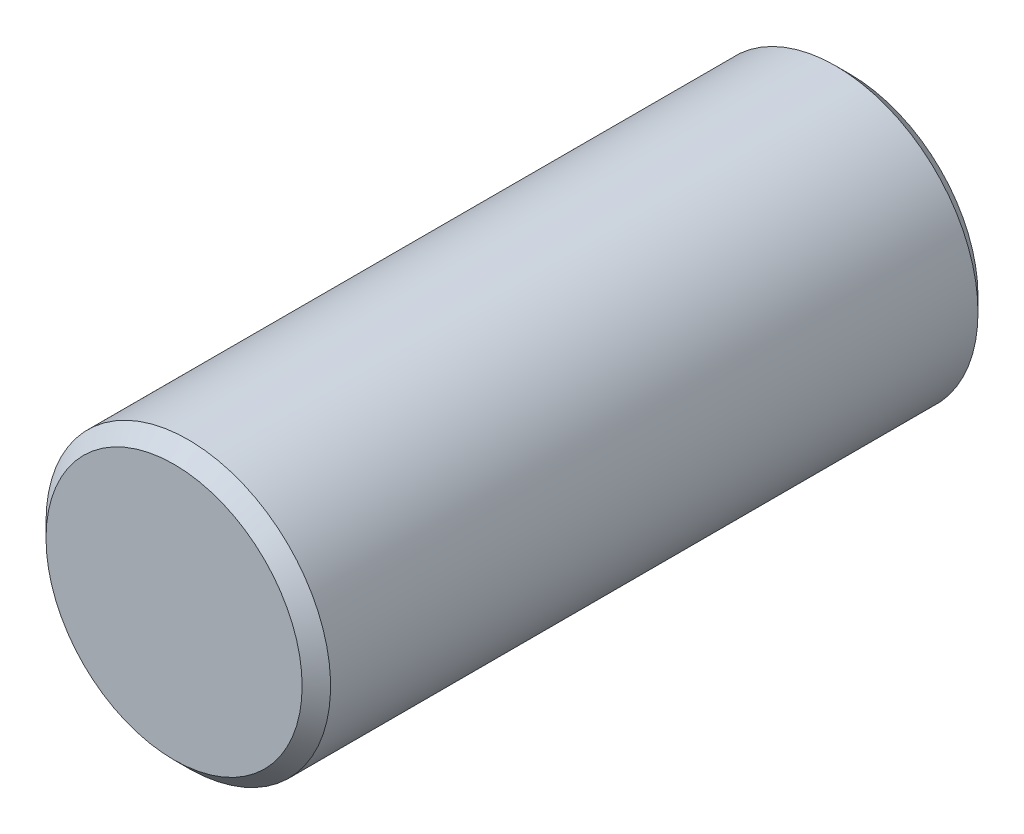
ISO-10303-21;
HEADER;
FILE_DESCRIPTION(('STEP AP214'),'2;1');
FILE_NAME('part.step','',(''),(''),'','','');
FILE_SCHEMA(('AUTOMOTIVE_DESIGN { 1 0 10303 214 1 1 1 1 }'));
ENDSEC;
DATA;
#1=APPLICATION_CONTEXT('core data for automotive mechanical design processes');
#2=APPLICATION_PROTOCOL_DEFINITION('international standard','automotive_design',2000,#1);
#3=PRODUCT_CONTEXT('',#1,'mechanical');
#4=PRODUCT('Part','Part','',(#3));
#5=PRODUCT_RELATED_PRODUCT_CATEGORY('part','',(#4));
#6=PRODUCT_DEFINITION_FORMATION('','',#4);
#7=PRODUCT_DEFINITION_CONTEXT('part definition',#1,'design');
#8=PRODUCT_DEFINITION('design','',#6,#7);
#9=PRODUCT_DEFINITION_SHAPE('','',#8);
#10=(LENGTH_UNIT() NAMED_UNIT(*) SI_UNIT(.MILLI.,.METRE.));
#11=(NAMED_UNIT(*) PLANE_ANGLE_UNIT() SI_UNIT($,.RADIAN.));
#12=(NAMED_UNIT(*) SI_UNIT($,.STERADIAN.) SOLID_ANGLE_UNIT());
#13=UNCERTAINTY_MEASURE_WITH_UNIT(LENGTH_MEASURE(1.E-05),#10,'distance_accuracy_value','');
#14=(GEOMETRIC_REPRESENTATION_CONTEXT(3) GLOBAL_UNCERTAINTY_ASSIGNED_CONTEXT((#13)) GLOBAL_UNIT_ASSIGNED_CONTEXT((#10,
#11,#12)) REPRESENTATION_CONTEXT('',''));
#15=CARTESIAN_POINT('',(0.,0.,0.));
#16=DIRECTION('',(0.,0.,1.));
#17=DIRECTION('',(1.,0.,0.));
#18=AXIS2_PLACEMENT_3D('',#15,#16,#17);
#19=CARTESIAN_POINT('',(0.,0.,60.325));
#20=DIRECTION('',(0.,0.,-1.));
#21=DIRECTION('',(-1.,0.,0.));
#22=AXIS2_PLACEMENT_3D('',#19,#20,#21);
#23=CYLINDRICAL_SURFACE('',#22,12.7);
#24=CARTESIAN_POINT('',(0.,0.,1.27000000000002));
#25=DIRECTION('',(0.,0.,1.));
#26=DIRECTION('',(1.,0.,0.));
#27=AXIS2_PLACEMENT_3D('',#24,#25,#26);
#28=CIRCLE('',#27,12.7);
#29=CARTESIAN_POINT('',(-12.7,0.,1.27000000000002));
#30=VERTEX_POINT('',#29);
#31=EDGE_CURVE('E45',#30,#30,#28,.T.);
#32=CARTESIAN_POINT('',(0.,0.,59.055));
#33=DIRECTION('',(0.,0.,1.));
#34=DIRECTION('',(1.,0.,0.));
#35=AXIS2_PLACEMENT_3D('',#32,#33,#34);
#36=CIRCLE('',#35,12.7);
#37=CARTESIAN_POINT('',(-12.7,0.,59.055));
#38=VERTEX_POINT('',#37);
#39=EDGE_CURVE('E49',#38,#38,#36,.F.);
#40=CARTESIAN_POINT('',(-12.7,0.,1.27000000000002));
#41=CARTESIAN_POINT('',(-12.7,0.,1.87192708333335));
#42=CARTESIAN_POINT('',(-12.7,0.,2.47385416666669));
#43=CARTESIAN_POINT('',(-12.7,0.,3.67770833333335));
#44=CARTESIAN_POINT('',(-12.7,0.,4.27963541666669));
#45=CARTESIAN_POINT('',(-12.7,0.,5.48348958333335));
#46=CARTESIAN_POINT('',(-12.7,0.,6.08541666666669));
#47=CARTESIAN_POINT('',(-12.7,0.,7.28927083333335));
#48=CARTESIAN_POINT('',(-12.7,0.,7.89119791666668));
#49=CARTESIAN_POINT('',(-12.7,0.,9.09505208333335));
#50=CARTESIAN_POINT('',(-12.7,0.,9.69697916666668));
#51=CARTESIAN_POINT('',(-12.7,0.,10.9008333333334));
#52=CARTESIAN_POINT('',(-12.7,0.,11.5027604166667));
#53=CARTESIAN_POINT('',(-12.7,0.,12.7066145833333));
#54=CARTESIAN_POINT('',(-12.7,0.,13.3085416666667));
#55=CARTESIAN_POINT('',(-12.7,0.,14.5123958333333));
#56=CARTESIAN_POINT('',(-12.7,0.,15.1143229166667));
#57=CARTESIAN_POINT('',(-12.7,0.,16.3181770833333));
#58=CARTESIAN_POINT('',(-12.7,0.,16.9201041666667));
#59=CARTESIAN_POINT('',(-12.7,0.,18.1239583333333));
#60=CARTESIAN_POINT('',(-12.7,0.,18.7258854166667));
#61=CARTESIAN_POINT('',(-12.7,0.,19.9297395833333));
#62=CARTESIAN_POINT('',(-12.7,0.,20.5316666666667));
#63=CARTESIAN_POINT('',(-12.7,0.,21.7355208333333));
#64=CARTESIAN_POINT('',(-12.7,0.,22.3374479166667));
#65=CARTESIAN_POINT('',(-12.7,0.,23.5413020833333));
#66=CARTESIAN_POINT('',(-12.7,0.,24.1432291666667));
#67=CARTESIAN_POINT('',(-12.7,0.,25.3470833333334));
#68=CARTESIAN_POINT('',(-12.7,0.,25.9490104166667));
#69=CARTESIAN_POINT('',(-12.7,0.,27.1528645833334));
#70=CARTESIAN_POINT('',(-12.7,0.,27.7547916666667));
#71=CARTESIAN_POINT('',(-12.7,0.,28.9586458333333));
#72=CARTESIAN_POINT('',(-12.7,0.,29.5605729166667));
#73=CARTESIAN_POINT('',(-12.7,0.,30.7644270833333));
#74=CARTESIAN_POINT('',(-12.7,0.,31.3663541666667));
#75=CARTESIAN_POINT('',(-12.7,0.,32.5702083333333));
#76=CARTESIAN_POINT('',(-12.7,0.,33.1721354166667));
#77=CARTESIAN_POINT('',(-12.7,0.,34.3759895833333));
#78=CARTESIAN_POINT('',(-12.7,0.,34.9779166666667));
#79=CARTESIAN_POINT('',(-12.7,0.,36.1817708333333));
#80=CARTESIAN_POINT('',(-12.7,0.,36.7836979166667));
#81=CARTESIAN_POINT('',(-12.7,0.,37.9875520833333));
#82=CARTESIAN_POINT('',(-12.7,0.,38.5894791666667));
#83=CARTESIAN_POINT('',(-12.7,0.,39.7933333333333));
#84=CARTESIAN_POINT('',(-12.7,0.,40.3952604166667));
#85=CARTESIAN_POINT('',(-12.7,0.,41.5991145833333));
#86=CARTESIAN_POINT('',(-12.7,0.,42.2010416666667));
#87=CARTESIAN_POINT('',(-12.7,0.,43.4048958333333));
#88=CARTESIAN_POINT('',(-12.7,0.,44.0068229166667));
#89=CARTESIAN_POINT('',(-12.7,0.,45.2106770833333));
#90=CARTESIAN_POINT('',(-12.7,0.,45.8126041666667));
#91=CARTESIAN_POINT('',(-12.7,0.,47.0164583333333));
#92=CARTESIAN_POINT('',(-12.7,0.,47.6183854166667));
#93=CARTESIAN_POINT('',(-12.7,0.,48.8222395833333));
#94=CARTESIAN_POINT('',(-12.7,0.,49.4241666666667));
#95=CARTESIAN_POINT('',(-12.7,0.,50.6280208333333));
#96=CARTESIAN_POINT('',(-12.7,0.,51.2299479166667));
#97=CARTESIAN_POINT('',(-12.7,0.,52.4338020833333));
#98=CARTESIAN_POINT('',(-12.7,0.,53.0357291666667));
#99=CARTESIAN_POINT('',(-12.7,0.,54.2395833333333));
#100=CARTESIAN_POINT('',(-12.7,0.,54.8415104166667));
#101=CARTESIAN_POINT('',(-12.7,0.,56.0453645833333));
#102=CARTESIAN_POINT('',(-12.7,0.,56.6472916666667));
#103=CARTESIAN_POINT('',(-12.7,0.,57.8511458333333));
#104=CARTESIAN_POINT('',(-12.7,0.,58.4530729166667));
#105=CARTESIAN_POINT('',(-12.7,0.,59.055));
#106=B_SPLINE_CURVE_WITH_KNOTS('',3,(#40,#41,#42,#43,#44,#45,#46,#47,#48,#49,#50,#51,#52,#53,
#54,#55,#56,#57,#58,#59,#60,#61,#62,#63,#64,#65,#66,#67,#68,#69,#70,#71,#72,#73,#74,#75,#76,#77,
#78,#79,#80,#81,#82,#83,#84,#85,#86,#87,#88,#89,#90,#91,#92,#93,#94,#95,#96,#97,#98,#99,#100,
#101,#102,#103,#104,#105),.UNSPECIFIED.,.F.,.F.,(4,2,2,2,2,2,2,2,2,2,2,2,2,2,2,2,2,2,2,2,2,2,2,
2,2,2,2,2,2,2,2,2,4),(0.,1.80578125,3.6115625,5.41734375,7.223125,9.02890625,10.8346875,
12.64046875,14.44625,16.25203125,18.0578125,19.86359375,21.669375,23.47515625,25.2809375,
27.08671875,28.8925,30.69828125,32.5040625,34.30984375,36.115625,37.92140625,39.7271875,
41.53296875,43.33875,45.14453125,46.9503125,48.75609375,50.561875,52.36765625,54.1734375,
55.97921875,57.785),.UNSPECIFIED.);
#107=EDGE_CURVE('BSEAM33',#30,#38,#106,.T.);
#108=ORIENTED_EDGE('',*,*,#31,.T.);
#109=ORIENTED_EDGE('',*,*,#39,.T.);
#110=ORIENTED_EDGE('',*,*,#107,.T.);
#111=ORIENTED_EDGE('',*,*,#107,.F.);
#112=EDGE_LOOP('',(#108,#110,#109,#111));
#113=FACE_BOUND('',#112,.T.);
#114=ADVANCED_FACE('F33',(#113),#23,.T.);
#115=CARTESIAN_POINT('',(0.,0.,60.325));
#116=DIRECTION('',(0.,0.,1.));
#117=DIRECTION('',(1.,0.,0.));
#118=AXIS2_PLACEMENT_3D('',#115,#116,#117);
#119=PLANE('',#118);
#120=CARTESIAN_POINT('',(0.,0.,60.325));
#121=DIRECTION('',(0.,0.,1.));
#122=DIRECTION('',(1.,0.,0.));
#123=AXIS2_PLACEMENT_3D('',#120,#121,#122);
#124=CIRCLE('',#123,11.43);
#125=CARTESIAN_POINT('',(11.43,0.,60.325));
#126=VERTEX_POINT('',#125);
#127=EDGE_CURVE('E10',#126,#126,#124,.T.);
#128=ORIENTED_EDGE('',*,*,#127,.T.);
#129=EDGE_LOOP('',(#128));
#130=FACE_BOUND('',#129,.T.);
#131=ADVANCED_FACE('F65',(#130),#119,.T.);
#132=CARTESIAN_POINT('',(0.,0.,0.));
#133=DIRECTION('',(0.,0.,1.));
#134=DIRECTION('',(1.,0.,0.));
#135=AXIS2_PLACEMENT_3D('',#132,#133,#134);
#136=PLANE('',#135);
#137=CARTESIAN_POINT('',(0.,0.,0.));
#138=DIRECTION('',(0.,0.,1.));
#139=DIRECTION('',(1.,0.,0.));
#140=AXIS2_PLACEMENT_3D('',#137,#138,#139);
#141=CIRCLE('',#140,11.43);
#142=CARTESIAN_POINT('',(11.43,0.,0.));
#143=VERTEX_POINT('',#142);
#144=EDGE_CURVE('E41',#143,#143,#141,.F.);
#145=ORIENTED_EDGE('',*,*,#144,.T.);
#146=EDGE_LOOP('',(#145));
#147=FACE_BOUND('',#146,.T.);
#148=ADVANCED_FACE('F62',(#147),#136,.F.);
#149=CARTESIAN_POINT('',(0.,0.,1.27000000000002));
#150=DIRECTION('',(0.,0.,1.));
#151=DIRECTION('',(1.,0.,0.));
#152=AXIS2_PLACEMENT_3D('',#149,#150,#151);
#153=CONICAL_SURFACE('',#152,12.7,0.785398163397453);
#154=ORIENTED_EDGE('',*,*,#144,.F.);
#155=EDGE_LOOP('',(#154));
#156=FACE_BOUND('',#155,.T.);
#157=ORIENTED_EDGE('',*,*,#31,.F.);
#158=EDGE_LOOP('',(#157));
#159=FACE_BOUND('',#158,.T.);
#160=ADVANCED_FACE('F58',(#156,#159),#153,.T.);
#161=CARTESIAN_POINT('',(0.,0.,60.325));
#162=DIRECTION('',(0.,0.,-1.));
#163=DIRECTION('',(-1.,0.,0.));
#164=AXIS2_PLACEMENT_3D('',#161,#162,#163);
#165=CONICAL_SURFACE('',#164,11.43,0.785398163397442);
#166=ORIENTED_EDGE('',*,*,#39,.F.);
#167=EDGE_LOOP('',(#166));
#168=FACE_BOUND('',#167,.T.);
#169=ORIENTED_EDGE('',*,*,#127,.F.);
#170=EDGE_LOOP('',(#169));
#171=FACE_BOUND('',#170,.T.);
#172=ADVANCED_FACE('F36',(#168,#171),#165,.T.);
#173=CLOSED_SHELL('',(#114,#131,#148,#160,#172));
#174=MANIFOLD_SOLID_BREP('B2',#173);
#175=ADVANCED_BREP_SHAPE_REPRESENTATION('',(#18,#174),#14);
#176=SHAPE_DEFINITION_REPRESENTATION(#9,#175);
ENDSEC;
END-ISO-10303-21;
